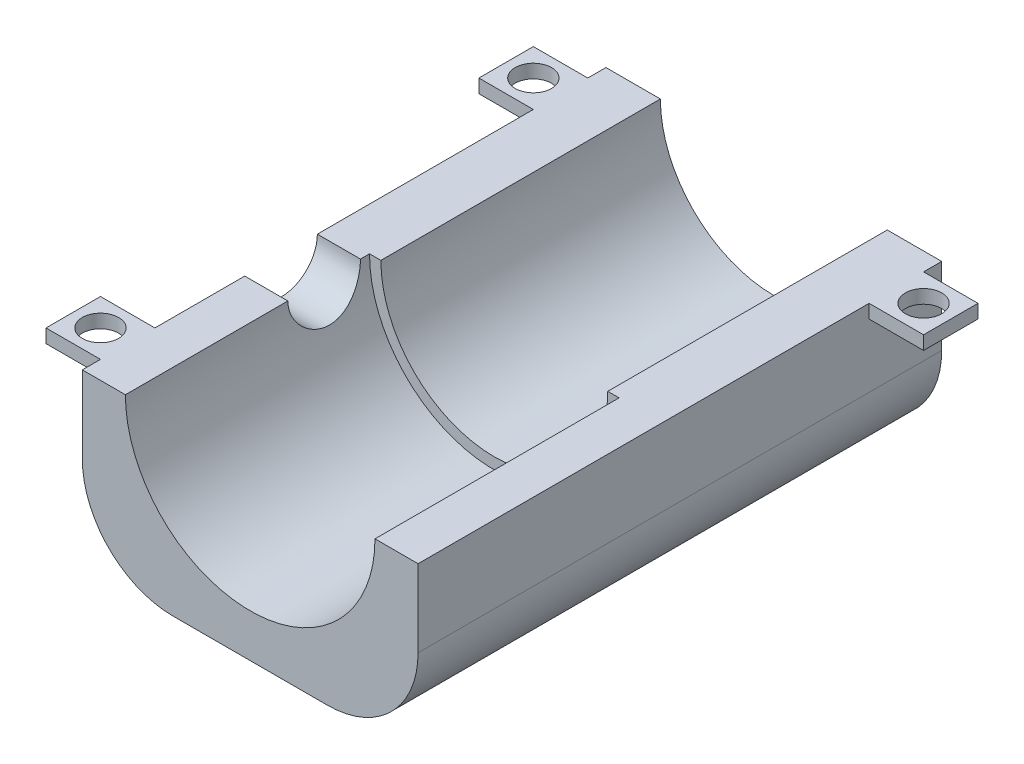
ISO-10303-21;
HEADER;
FILE_DESCRIPTION(('STEP AP214'),'2;1');
FILE_NAME('part.step','',(''),(''),'','','');
FILE_SCHEMA(('AUTOMOTIVE_DESIGN { 1 0 10303 214 1 1 1 1 }'));
ENDSEC;
DATA;
#1=APPLICATION_CONTEXT('core data for automotive mechanical design processes');
#2=APPLICATION_PROTOCOL_DEFINITION('international standard','automotive_design',2000,#1);
#3=PRODUCT_CONTEXT('',#1,'mechanical');
#4=PRODUCT('Part','Part','',(#3));
#5=PRODUCT_RELATED_PRODUCT_CATEGORY('part','',(#4));
#6=PRODUCT_DEFINITION_FORMATION('','',#4);
#7=PRODUCT_DEFINITION_CONTEXT('part definition',#1,'design');
#8=PRODUCT_DEFINITION('design','',#6,#7);
#9=PRODUCT_DEFINITION_SHAPE('','',#8);
#10=(LENGTH_UNIT() NAMED_UNIT(*) SI_UNIT(.MILLI.,.METRE.));
#11=(NAMED_UNIT(*) PLANE_ANGLE_UNIT() SI_UNIT($,.RADIAN.));
#12=(NAMED_UNIT(*) SI_UNIT($,.STERADIAN.) SOLID_ANGLE_UNIT());
#13=UNCERTAINTY_MEASURE_WITH_UNIT(LENGTH_MEASURE(1.E-05),#10,'distance_accuracy_value','');
#14=(GEOMETRIC_REPRESENTATION_CONTEXT(3) GLOBAL_UNCERTAINTY_ASSIGNED_CONTEXT((#13)) GLOBAL_UNIT_ASSIGNED_CONTEXT((#10,
#11,#12)) REPRESENTATION_CONTEXT('',''));
#15=CARTESIAN_POINT('',(0.,0.,0.));
#16=DIRECTION('',(0.,0.,1.));
#17=DIRECTION('',(1.,0.,0.));
#18=AXIS2_PLACEMENT_3D('',#15,#16,#17);
#19=CARTESIAN_POINT('',(18.5,-18.5,-57.7));
#20=DIRECTION('',(1.,0.,0.));
#21=DIRECTION('',(0.,1.,0.));
#22=AXIS2_PLACEMENT_3D('',#19,#20,#21);
#23=PLANE('',#22);
#24=DIRECTION('',(0.,0.,1.));
#25=VECTOR('',#24,1.);
#26=CARTESIAN_POINT('',(18.5,0.,-57.7));
#27=LINE('',#26,#25);
#28=CARTESIAN_POINT('',(18.5,0.,-49.7));
#29=VERTEX_POINT('',#28);
#30=CARTESIAN_POINT('',(18.5,0.,0.));
#31=VERTEX_POINT('',#30);
#32=EDGE_CURVE('E300',#29,#31,#27,.T.);
#33=ORIENTED_EDGE('',*,*,#32,.T.);
#34=DIRECTION('',(0.,1.,0.));
#35=VECTOR('',#34,1.);
#36=CARTESIAN_POINT('',(18.5,-18.5,0.));
#37=LINE('',#36,#35);
#38=CARTESIAN_POINT('',(18.5,-8.5,0.));
#39=VERTEX_POINT('',#38);
#40=EDGE_CURVE('E267',#39,#31,#37,.T.);
#41=ORIENTED_EDGE('',*,*,#40,.F.);
#42=DIRECTION('',(0.,0.,1.));
#43=VECTOR('',#42,1.);
#44=CARTESIAN_POINT('',(18.5,-8.5,-57.7));
#45=LINE('',#44,#43);
#46=CARTESIAN_POINT('',(18.5,-8.5,-57.7));
#47=VERTEX_POINT('',#46);
#48=EDGE_CURVE('E59',#39,#47,#45,.F.);
#49=ORIENTED_EDGE('',*,*,#48,.T.);
#50=DIRECTION('',(0.,1.,0.));
#51=VECTOR('',#50,1.);
#52=CARTESIAN_POINT('',(18.5,-18.5,-57.7));
#53=LINE('',#52,#51);
#54=CARTESIAN_POINT('',(18.5,0.,-57.7));
#55=VERTEX_POINT('',#54);
#56=EDGE_CURVE('E275',#47,#55,#53,.T.);
#57=ORIENTED_EDGE('',*,*,#56,.T.);
#58=CARTESIAN_POINT('',(18.5,0.,-55.7));
#59=VERTEX_POINT('',#58);
#60=EDGE_CURVE('E296',#55,#59,#27,.T.);
#61=ORIENTED_EDGE('',*,*,#60,.T.);
#62=DIRECTION('',(0.,-1.,0.));
#63=VECTOR('',#62,1.);
#64=CARTESIAN_POINT('',(18.5,0.,-55.7));
#65=LINE('',#64,#63);
#66=CARTESIAN_POINT('',(18.5,-1.49999999999999,-55.7));
#67=VERTEX_POINT('',#66);
#68=EDGE_CURVE('E424',#59,#67,#65,.T.);
#69=ORIENTED_EDGE('',*,*,#68,.T.);
#70=DIRECTION('',(0.,0.,1.));
#71=VECTOR('',#70,1.);
#72=CARTESIAN_POINT('',(18.5,-1.5,0.));
#73=LINE('',#72,#71);
#74=CARTESIAN_POINT('',(18.5,-1.5,-49.7));
#75=VERTEX_POINT('',#74);
#76=EDGE_CURVE('E439',#67,#75,#73,.T.);
#77=ORIENTED_EDGE('',*,*,#76,.T.);
#78=DIRECTION('',(0.,-1.,0.));
#79=VECTOR('',#78,1.);
#80=CARTESIAN_POINT('',(18.5,0.,-49.7));
#81=LINE('',#80,#79);
#82=EDGE_CURVE('E410',#29,#75,#81,.T.);
#83=ORIENTED_EDGE('',*,*,#82,.F.);
#84=EDGE_LOOP('',(#33,#41,#49,#57,#61,#69,#77,#83));
#85=FACE_BOUND('',#84,.T.);
#86=ADVANCED_FACE('F44',(#85),#23,.T.);
#87=CARTESIAN_POINT('',(-13.5,0.,-57.7));
#88=DIRECTION('',(0.,1.,0.));
#89=DIRECTION('',(-1.,0.,0.));
#90=AXIS2_PLACEMENT_3D('',#87,#88,#89);
#91=PLANE('',#90);
#92=DIRECTION('',(0.,0.,1.));
#93=VECTOR('',#92,1.);
#94=CARTESIAN_POINT('',(-12.5,0.,-57.7));
#95=LINE('',#94,#93);
#96=CARTESIAN_POINT('',(-12.5,0.,-57.7));
#97=VERTEX_POINT('',#96);
#98=CARTESIAN_POINT('',(-12.5,0.,-26.9));
#99=VERTEX_POINT('',#98);
#100=EDGE_CURVE('E66',#97,#99,#95,.T.);
#101=ORIENTED_EDGE('',*,*,#100,.F.);
#102=DIRECTION('',(-1.,0.,0.));
#103=VECTOR('',#102,1.);
#104=CARTESIAN_POINT('',(-13.5,0.,-57.7));
#105=LINE('',#104,#103);
#106=CARTESIAN_POINT('',(-18.5,0.,-57.7));
#107=VERTEX_POINT('',#106);
#108=EDGE_CURVE('E250',#97,#107,#105,.T.);
#109=ORIENTED_EDGE('',*,*,#108,.T.);
#110=DIRECTION('',(0.,0.,1.));
#111=VECTOR('',#110,1.);
#112=CARTESIAN_POINT('',(-18.5,0.,-57.7));
#113=LINE('',#112,#111);
#114=CARTESIAN_POINT('',(-18.5,0.,-55.7));
#115=VERTEX_POINT('',#114);
#116=EDGE_CURVE('E301',#107,#115,#113,.T.);
#117=ORIENTED_EDGE('',*,*,#116,.T.);
#118=DIRECTION('',(1.,0.,0.));
#119=VECTOR('',#118,1.);
#120=CARTESIAN_POINT('',(-24.5,0.,-55.7));
#121=LINE('',#120,#119);
#122=CARTESIAN_POINT('',(-24.5,0.,-55.7));
#123=VERTEX_POINT('',#122);
#124=EDGE_CURVE('E396',#123,#115,#121,.T.);
#125=ORIENTED_EDGE('',*,*,#124,.F.);
#126=DIRECTION('',(0.,0.,-1.));
#127=VECTOR('',#126,1.);
#128=CARTESIAN_POINT('',(-24.5,0.,-57.7));
#129=LINE('',#128,#127);
#130=CARTESIAN_POINT('',(-24.5,0.,-49.7));
#131=VERTEX_POINT('',#130);
#132=EDGE_CURVE('E385',#131,#123,#129,.T.);
#133=ORIENTED_EDGE('',*,*,#132,.F.);
#134=DIRECTION('',(1.,0.,0.));
#135=VECTOR('',#134,1.);
#136=CARTESIAN_POINT('',(-24.5,0.,-49.7));
#137=LINE('',#136,#135);
#138=CARTESIAN_POINT('',(-18.5,0.,-49.7));
#139=VERTEX_POINT('',#138);
#140=EDGE_CURVE('E414',#131,#139,#137,.T.);
#141=ORIENTED_EDGE('',*,*,#140,.T.);
#142=CARTESIAN_POINT('',(-18.5,0.,-25.9));
#143=VERTEX_POINT('',#142);
#144=EDGE_CURVE('E304',#139,#143,#113,.T.);
#145=ORIENTED_EDGE('',*,*,#144,.T.);
#146=DIRECTION('',(-1.,0.,0.));
#147=VECTOR('',#146,1.);
#148=CARTESIAN_POINT('',(-3.5,0.,-25.9));
#149=LINE('',#148,#147);
#150=CARTESIAN_POINT('',(-13.75,0.,-25.9));
#151=VERTEX_POINT('',#150);
#152=EDGE_CURVE('E463',#151,#143,#149,.T.);
#153=ORIENTED_EDGE('',*,*,#152,.F.);
#154=DIRECTION('',(0.,0.,1.));
#155=VECTOR('',#154,1.);
#156=CARTESIAN_POINT('',(-13.75,0.,-57.6459346906221));
#157=LINE('',#156,#155);
#158=CARTESIAN_POINT('',(-13.75,0.,-26.9));
#159=VERTEX_POINT('',#158);
#160=EDGE_CURVE('E74',#159,#151,#157,.T.);
#161=ORIENTED_EDGE('',*,*,#160,.F.);
#162=DIRECTION('',(-1.,0.,0.));
#163=VECTOR('',#162,1.);
#164=CARTESIAN_POINT('',(-13.5,0.,-26.9));
#165=LINE('',#164,#163);
#166=EDGE_CURVE('E252',#99,#159,#165,.T.);
#167=ORIENTED_EDGE('',*,*,#166,.F.);
#168=EDGE_LOOP('',(#101,#109,#117,#125,#133,#141,#145,#153,#161,#167));
#169=FACE_BOUND('',#168,.T.);
#170=CARTESIAN_POINT('',(-21.5,0.,-52.7));
#171=DIRECTION('',(0.,1.,0.));
#172=DIRECTION('',(0.,0.,-1.));
#173=AXIS2_PLACEMENT_3D('',#170,#171,#172);
#174=CIRCLE('',#173,2.00000000000001);
#175=CARTESIAN_POINT('',(-21.5,0.,-54.7));
#176=VERTEX_POINT('',#175);
#177=EDGE_CURVE('E525',#176,#176,#174,.T.);
#178=ORIENTED_EDGE('',*,*,#177,.F.);
#179=EDGE_LOOP('',(#178));
#180=FACE_BOUND('',#179,.T.);
#181=ADVANCED_FACE('F247',(#169,#180),#91,.T.);
#182=CARTESIAN_POINT('',(-13.75,0.,-17.9));
#183=VERTEX_POINT('',#182);
#184=CARTESIAN_POINT('',(-13.75,0.,0.));
#185=VERTEX_POINT('',#184);
#186=EDGE_CURVE('E483',#183,#185,#157,.T.);
#187=ORIENTED_EDGE('',*,*,#186,.F.);
#188=DIRECTION('',(-1.,0.,0.));
#189=VECTOR('',#188,1.);
#190=CARTESIAN_POINT('',(-3.5,0.,-17.9));
#191=LINE('',#190,#189);
#192=CARTESIAN_POINT('',(-18.5,0.,-17.9));
#193=VERTEX_POINT('',#192);
#194=EDGE_CURVE('E459',#193,#183,#191,.F.);
#195=ORIENTED_EDGE('',*,*,#194,.F.);
#196=CARTESIAN_POINT('',(-18.5,0.,-8.));
#197=VERTEX_POINT('',#196);
#198=EDGE_CURVE('E305',#193,#197,#113,.T.);
#199=ORIENTED_EDGE('',*,*,#198,.T.);
#200=DIRECTION('',(1.,0.,0.));
#201=VECTOR('',#200,1.);
#202=CARTESIAN_POINT('',(-24.5,0.,-8.));
#203=LINE('',#202,#201);
#204=CARTESIAN_POINT('',(-24.5,0.,-8.));
#205=VERTEX_POINT('',#204);
#206=EDGE_CURVE('E377',#205,#197,#203,.T.);
#207=ORIENTED_EDGE('',*,*,#206,.F.);
#208=DIRECTION('',(0.,0.,-1.));
#209=VECTOR('',#208,1.);
#210=CARTESIAN_POINT('',(-24.5,0.,-57.7));
#211=LINE('',#210,#209);
#212=CARTESIAN_POINT('',(-24.5,0.,-2.));
#213=VERTEX_POINT('',#212);
#214=EDGE_CURVE('E366',#213,#205,#211,.T.);
#215=ORIENTED_EDGE('',*,*,#214,.F.);
#216=DIRECTION('',(1.,0.,0.));
#217=VECTOR('',#216,1.);
#218=CARTESIAN_POINT('',(-24.5,0.,-2.));
#219=LINE('',#218,#217);
#220=CARTESIAN_POINT('',(-18.5,0.,-2.));
#221=VERTEX_POINT('',#220);
#222=EDGE_CURVE('E367',#213,#221,#219,.T.);
#223=ORIENTED_EDGE('',*,*,#222,.T.);
#224=CARTESIAN_POINT('',(-18.5,0.,0.));
#225=VERTEX_POINT('',#224);
#226=EDGE_CURVE('E281',#221,#225,#113,.T.);
#227=ORIENTED_EDGE('',*,*,#226,.T.);
#228=DIRECTION('',(-1.,0.,0.));
#229=VECTOR('',#228,1.);
#230=CARTESIAN_POINT('',(-13.5,0.,0.));
#231=LINE('',#230,#229);
#232=EDGE_CURVE('E282',#185,#225,#231,.T.);
#233=ORIENTED_EDGE('',*,*,#232,.F.);
#234=EDGE_LOOP('',(#187,#195,#199,#207,#215,#223,#227,#233));
#235=FACE_BOUND('',#234,.T.);
#236=CARTESIAN_POINT('',(-21.5,0.,-5.));
#237=DIRECTION('',(0.,1.,0.));
#238=DIRECTION('',(0.,0.,-1.));
#239=AXIS2_PLACEMENT_3D('',#236,#237,#238);
#240=CIRCLE('',#239,2.);
#241=CARTESIAN_POINT('',(-21.5,0.,-7.));
#242=VERTEX_POINT('',#241);
#243=EDGE_CURVE('E538',#242,#242,#240,.T.);
#244=ORIENTED_EDGE('',*,*,#243,.F.);
#245=EDGE_LOOP('',(#244));
#246=FACE_BOUND('',#245,.T.);
#247=ADVANCED_FACE('F569',(#235,#246),#91,.T.);
#248=CARTESIAN_POINT('',(18.5,0.,-57.7));
#249=DIRECTION('',(0.,1.,0.));
#250=DIRECTION('',(0.,0.,1.));
#251=AXIS2_PLACEMENT_3D('',#248,#249,#250);
#252=PLANE('',#251);
#253=DIRECTION('',(-1.,0.,0.));
#254=VECTOR('',#253,1.);
#255=CARTESIAN_POINT('',(18.5,0.,0.));
#256=LINE('',#255,#254);
#257=CARTESIAN_POINT('',(13.75,0.,0.));
#258=VERTEX_POINT('',#257);
#259=EDGE_CURVE('E260',#31,#258,#256,.T.);
#260=ORIENTED_EDGE('',*,*,#259,.F.);
#261=ORIENTED_EDGE('',*,*,#32,.F.);
#262=DIRECTION('',(-1.,0.,0.));
#263=VECTOR('',#262,1.);
#264=CARTESIAN_POINT('',(24.5,0.,-49.7));
#265=LINE('',#264,#263);
#266=CARTESIAN_POINT('',(24.5,0.,-49.7));
#267=VERTEX_POINT('',#266);
#268=EDGE_CURVE('E455',#267,#29,#265,.T.);
#269=ORIENTED_EDGE('',*,*,#268,.F.);
#270=DIRECTION('',(0.,0.,1.));
#271=VECTOR('',#270,1.);
#272=CARTESIAN_POINT('',(24.5,0.,0.));
#273=LINE('',#272,#271);
#274=CARTESIAN_POINT('',(24.5,0.,-55.7));
#275=VERTEX_POINT('',#274);
#276=EDGE_CURVE('E419',#275,#267,#273,.T.);
#277=ORIENTED_EDGE('',*,*,#276,.F.);
#278=DIRECTION('',(-1.,0.,0.));
#279=VECTOR('',#278,1.);
#280=CARTESIAN_POINT('',(24.5,0.,-55.7));
#281=LINE('',#280,#279);
#282=EDGE_CURVE('E435',#275,#59,#281,.T.);
#283=ORIENTED_EDGE('',*,*,#282,.T.);
#284=ORIENTED_EDGE('',*,*,#60,.F.);
#285=DIRECTION('',(-1.,0.,0.));
#286=VECTOR('',#285,1.);
#287=CARTESIAN_POINT('',(18.5,0.,-57.7));
#288=LINE('',#287,#286);
#289=CARTESIAN_POINT('',(12.5,0.,-57.7));
#290=VERTEX_POINT('',#289);
#291=EDGE_CURVE('E278',#55,#290,#288,.T.);
#292=ORIENTED_EDGE('',*,*,#291,.T.);
#293=DIRECTION('',(0.,0.,1.));
#294=VECTOR('',#293,1.);
#295=CARTESIAN_POINT('',(12.5,0.,-57.7));
#296=LINE('',#295,#294);
#297=CARTESIAN_POINT('',(12.5,0.,-26.9));
#298=VERTEX_POINT('',#297);
#299=EDGE_CURVE('E237',#290,#298,#296,.T.);
#300=ORIENTED_EDGE('',*,*,#299,.T.);
#301=DIRECTION('',(-1.,0.,0.));
#302=VECTOR('',#301,1.);
#303=CARTESIAN_POINT('',(13.5,0.,-26.9));
#304=LINE('',#303,#302);
#305=CARTESIAN_POINT('',(13.75,0.,-26.9));
#306=VERTEX_POINT('',#305);
#307=EDGE_CURVE('E465',#306,#298,#304,.T.);
#308=ORIENTED_EDGE('',*,*,#307,.F.);
#309=DIRECTION('',(0.,0.,1.));
#310=VECTOR('',#309,1.);
#311=CARTESIAN_POINT('',(13.75,0.,-57.6459346906221));
#312=LINE('',#311,#310);
#313=EDGE_CURVE('E476',#306,#258,#312,.T.);
#314=ORIENTED_EDGE('',*,*,#313,.T.);
#315=EDGE_LOOP('',(#260,#261,#269,#277,#283,#284,#292,#300,#308,#314));
#316=FACE_BOUND('',#315,.T.);
#317=CARTESIAN_POINT('',(21.5,0.,-52.7));
#318=DIRECTION('',(0.,1.,0.));
#319=DIRECTION('',(0.,0.,1.));
#320=AXIS2_PLACEMENT_3D('',#317,#318,#319);
#321=CIRCLE('',#320,2.00000000000001);
#322=CARTESIAN_POINT('',(21.5,0.,-50.7));
#323=VERTEX_POINT('',#322);
#324=EDGE_CURVE('E338',#323,#323,#321,.T.);
#325=ORIENTED_EDGE('',*,*,#324,.F.);
#326=EDGE_LOOP('',(#325));
#327=FACE_BOUND('',#326,.T.);
#328=ADVANCED_FACE('F599',(#316,#327),#252,.T.);
#329=CARTESIAN_POINT('',(-18.5,-18.5,-57.7));
#330=DIRECTION('',(0.,-1.,0.));
#331=DIRECTION('',(0.,0.,-1.));
#332=AXIS2_PLACEMENT_3D('',#329,#330,#331);
#333=PLANE('',#332);
#334=DIRECTION('',(0.,0.,1.));
#335=VECTOR('',#334,1.);
#336=CARTESIAN_POINT('',(7.25,-18.5,-30.2));
#337=LINE('',#336,#335);
#338=CARTESIAN_POINT('',(7.25,-18.5,-55.7));
#339=VERTEX_POINT('',#338);
#340=CARTESIAN_POINT('',(7.25,-18.5,-30.2));
#341=VERTEX_POINT('',#340);
#342=EDGE_CURVE('E478',#339,#341,#337,.T.);
#343=ORIENTED_EDGE('',*,*,#342,.F.);
#344=DIRECTION('',(1.,0.,0.));
#345=VECTOR('',#344,1.);
#346=CARTESIAN_POINT('',(7.25,-18.5,-55.7));
#347=LINE('',#346,#345);
#348=CARTESIAN_POINT('',(-7.25,-18.5,-55.7));
#349=VERTEX_POINT('',#348);
#350=EDGE_CURVE('E496',#349,#339,#347,.T.);
#351=ORIENTED_EDGE('',*,*,#350,.F.);
#352=DIRECTION('',(0.,0.,-1.));
#353=VECTOR('',#352,1.);
#354=CARTESIAN_POINT('',(-7.25,-18.5,-30.2));
#355=LINE('',#354,#353);
#356=CARTESIAN_POINT('',(-7.25,-18.5,-30.2));
#357=VERTEX_POINT('',#356);
#358=EDGE_CURVE('E515',#357,#349,#355,.T.);
#359=ORIENTED_EDGE('',*,*,#358,.F.);
#360=DIRECTION('',(-1.,0.,0.));
#361=VECTOR('',#360,1.);
#362=CARTESIAN_POINT('',(7.25,-18.5,-30.2));
#363=LINE('',#362,#361);
#364=EDGE_CURVE('E511',#341,#357,#363,.T.);
#365=ORIENTED_EDGE('',*,*,#364,.F.);
#366=EDGE_LOOP('',(#343,#351,#359,#365));
#367=FACE_BOUND('',#366,.T.);
#368=DIRECTION('',(1.,0.,0.));
#369=VECTOR('',#368,1.);
#370=CARTESIAN_POINT('',(-18.5,-18.5,0.));
#371=LINE('',#370,#369);
#372=CARTESIAN_POINT('',(-8.5,-18.5,0.));
#373=VERTEX_POINT('',#372);
#374=CARTESIAN_POINT('',(8.5,-18.5,0.));
#375=VERTEX_POINT('',#374);
#376=EDGE_CURVE('E289',#373,#375,#371,.T.);
#377=ORIENTED_EDGE('',*,*,#376,.F.);
#378=DIRECTION('',(0.,0.,1.));
#379=VECTOR('',#378,1.);
#380=CARTESIAN_POINT('',(-8.5,-18.5,-57.7));
#381=LINE('',#380,#379);
#382=CARTESIAN_POINT('',(-8.5,-18.5,-57.7));
#383=VERTEX_POINT('',#382);
#384=EDGE_CURVE('E322',#373,#383,#381,.F.);
#385=ORIENTED_EDGE('',*,*,#384,.T.);
#386=DIRECTION('',(1.,0.,0.));
#387=VECTOR('',#386,1.);
#388=CARTESIAN_POINT('',(-18.5,-18.5,-57.7));
#389=LINE('',#388,#387);
#390=CARTESIAN_POINT('',(8.5,-18.5,-57.7));
#391=VERTEX_POINT('',#390);
#392=EDGE_CURVE('E264',#383,#391,#389,.T.);
#393=ORIENTED_EDGE('',*,*,#392,.T.);
#394=DIRECTION('',(0.,0.,1.));
#395=VECTOR('',#394,1.);
#396=CARTESIAN_POINT('',(8.5,-18.5,-57.7));
#397=LINE('',#396,#395);
#398=EDGE_CURVE('E318',#391,#375,#397,.T.);
#399=ORIENTED_EDGE('',*,*,#398,.T.);
#400=EDGE_LOOP('',(#377,#385,#393,#399));
#401=FACE_BOUND('',#400,.T.);
#402=ADVANCED_FACE('F611',(#367,#401),#333,.T.);
#403=CARTESIAN_POINT('',(-18.5,0.,-57.7));
#404=DIRECTION('',(-1.,0.,0.));
#405=DIRECTION('',(0.,-1.,0.));
#406=AXIS2_PLACEMENT_3D('',#403,#404,#405);
#407=PLANE('',#406);
#408=DIRECTION('',(0.,1.,0.));
#409=VECTOR('',#408,1.);
#410=CARTESIAN_POINT('',(-18.5,0.,-8.));
#411=LINE('',#410,#409);
#412=CARTESIAN_POINT('',(-18.5,-1.5,-8.));
#413=VERTEX_POINT('',#412);
#414=EDGE_CURVE('E344',#413,#197,#411,.T.);
#415=ORIENTED_EDGE('',*,*,#414,.T.);
#416=ORIENTED_EDGE('',*,*,#198,.F.);
#417=CARTESIAN_POINT('',(-18.5,0.,-21.9));
#418=DIRECTION('',(-1.,0.,0.));
#419=DIRECTION('',(0.,-1.,0.));
#420=AXIS2_PLACEMENT_3D('',#417,#418,#419);
#421=CIRCLE('',#420,4.);
#422=EDGE_CURVE('E299',#143,#193,#421,.T.);
#423=ORIENTED_EDGE('',*,*,#422,.F.);
#424=ORIENTED_EDGE('',*,*,#144,.F.);
#425=DIRECTION('',(0.,1.,0.));
#426=VECTOR('',#425,1.);
#427=CARTESIAN_POINT('',(-18.5,0.,-49.7));
#428=LINE('',#427,#426);
#429=CARTESIAN_POINT('',(-18.5,-1.49999999999999,-49.7));
#430=VERTEX_POINT('',#429);
#431=EDGE_CURVE('E400',#430,#139,#428,.T.);
#432=ORIENTED_EDGE('',*,*,#431,.F.);
#433=DIRECTION('',(0.,0.,-1.));
#434=VECTOR('',#433,1.);
#435=CARTESIAN_POINT('',(-18.5,-1.49999999999999,-57.7));
#436=LINE('',#435,#434);
#437=CARTESIAN_POINT('',(-18.5,-1.49999999999999,-55.7));
#438=VERTEX_POINT('',#437);
#439=EDGE_CURVE('E386',#430,#438,#436,.T.);
#440=ORIENTED_EDGE('',*,*,#439,.T.);
#441=DIRECTION('',(0.,1.,0.));
#442=VECTOR('',#441,1.);
#443=CARTESIAN_POINT('',(-18.5,0.,-55.7));
#444=LINE('',#443,#442);
#445=EDGE_CURVE('E380',#438,#115,#444,.T.);
#446=ORIENTED_EDGE('',*,*,#445,.T.);
#447=ORIENTED_EDGE('',*,*,#116,.F.);
#448=DIRECTION('',(0.,-1.,0.));
#449=VECTOR('',#448,1.);
#450=CARTESIAN_POINT('',(-18.5,0.,-57.7));
#451=LINE('',#450,#449);
#452=CARTESIAN_POINT('',(-18.5,-8.5,-57.7));
#453=VERTEX_POINT('',#452);
#454=EDGE_CURVE('E258',#107,#453,#451,.T.);
#455=ORIENTED_EDGE('',*,*,#454,.T.);
#456=DIRECTION('',(0.,0.,1.));
#457=VECTOR('',#456,1.);
#458=CARTESIAN_POINT('',(-18.5,-8.5,-57.7));
#459=LINE('',#458,#457);
#460=CARTESIAN_POINT('',(-18.5,-8.5,0.));
#461=VERTEX_POINT('',#460);
#462=EDGE_CURVE('E308',#453,#461,#459,.T.);
#463=ORIENTED_EDGE('',*,*,#462,.T.);
#464=DIRECTION('',(0.,-1.,0.));
#465=VECTOR('',#464,1.);
#466=CARTESIAN_POINT('',(-18.5,0.,0.));
#467=LINE('',#466,#465);
#468=EDGE_CURVE('E285',#225,#461,#467,.T.);
#469=ORIENTED_EDGE('',*,*,#468,.F.);
#470=ORIENTED_EDGE('',*,*,#226,.F.);
#471=DIRECTION('',(0.,1.,0.));
#472=VECTOR('',#471,1.);
#473=CARTESIAN_POINT('',(-18.5,0.,-2.));
#474=LINE('',#473,#472);
#475=CARTESIAN_POINT('',(-18.5,-1.5,-2.));
#476=VERTEX_POINT('',#475);
#477=EDGE_CURVE('E358',#476,#221,#474,.T.);
#478=ORIENTED_EDGE('',*,*,#477,.F.);
#479=DIRECTION('',(0.,0.,1.));
#480=VECTOR('',#479,1.);
#481=CARTESIAN_POINT('',(-18.5,-1.5,-57.7));
#482=LINE('',#481,#480);
#483=EDGE_CURVE('E349',#413,#476,#482,.T.);
#484=ORIENTED_EDGE('',*,*,#483,.F.);
#485=EDGE_LOOP('',(#415,#416,#423,#424,#432,#440,#446,#447,#455,#463,#469,#470,#478,#484));
#486=FACE_BOUND('',#485,.T.);
#487=ADVANCED_FACE('F576',(#486),#407,.T.);
#488=CARTESIAN_POINT('',(0.,0.,-57.7));
#489=DIRECTION('',(0.,0.,1.));
#490=DIRECTION('',(1.,0.,0.));
#491=AXIS2_PLACEMENT_3D('',#488,#489,#490);
#492=PLANE('',#491);
#493=ORIENTED_EDGE('',*,*,#108,.F.);
#494=CARTESIAN_POINT('',(0.,0.,-57.7));
#495=DIRECTION('',(0.,0.,1.));
#496=DIRECTION('',(1.,0.,0.));
#497=AXIS2_PLACEMENT_3D('',#494,#495,#496);
#498=CIRCLE('',#497,12.5);
#499=EDGE_CURVE('E234',#97,#290,#498,.T.);
#500=ORIENTED_EDGE('',*,*,#499,.T.);
#501=ORIENTED_EDGE('',*,*,#291,.F.);
#502=ORIENTED_EDGE('',*,*,#56,.F.);
#503=CARTESIAN_POINT('',(8.5,-8.5,-57.7));
#504=DIRECTION('',(0.,0.,1.));
#505=DIRECTION('',(1.,0.,0.));
#506=AXIS2_PLACEMENT_3D('',#503,#504,#505);
#507=CIRCLE('',#506,10.);
#508=EDGE_CURVE('E325',#47,#391,#507,.F.);
#509=ORIENTED_EDGE('',*,*,#508,.T.);
#510=ORIENTED_EDGE('',*,*,#392,.F.);
#511=CARTESIAN_POINT('',(-8.5,-8.5,-57.7));
#512=DIRECTION('',(0.,0.,1.));
#513=DIRECTION('',(1.,0.,0.));
#514=AXIS2_PLACEMENT_3D('',#511,#512,#513);
#515=CIRCLE('',#514,10.);
#516=EDGE_CURVE('E328',#383,#453,#515,.F.);
#517=ORIENTED_EDGE('',*,*,#516,.T.);
#518=ORIENTED_EDGE('',*,*,#454,.F.);
#519=EDGE_LOOP('',(#493,#500,#501,#502,#509,#510,#517,#518));
#520=FACE_BOUND('',#519,.T.);
#521=ADVANCED_FACE('F256',(#520),#492,.F.);
#522=CARTESIAN_POINT('',(0.,0.,0.));
#523=DIRECTION('',(0.,0.,1.));
#524=DIRECTION('',(1.,0.,0.));
#525=AXIS2_PLACEMENT_3D('',#522,#523,#524);
#526=PLANE('',#525);
#527=CARTESIAN_POINT('',(0.,0.,0.));
#528=DIRECTION('',(0.,0.,1.));
#529=DIRECTION('',(1.,0.,0.));
#530=AXIS2_PLACEMENT_3D('',#527,#528,#529);
#531=CIRCLE('',#530,13.75);
#532=EDGE_CURVE('E488',#185,#258,#531,.T.);
#533=ORIENTED_EDGE('',*,*,#532,.F.);
#534=ORIENTED_EDGE('',*,*,#232,.T.);
#535=ORIENTED_EDGE('',*,*,#468,.T.);
#536=CARTESIAN_POINT('',(-8.5,-8.5,0.));
#537=DIRECTION('',(0.,0.,1.));
#538=DIRECTION('',(1.,0.,0.));
#539=AXIS2_PLACEMENT_3D('',#536,#537,#538);
#540=CIRCLE('',#539,10.);
#541=EDGE_CURVE('E315',#461,#373,#540,.T.);
#542=ORIENTED_EDGE('',*,*,#541,.T.);
#543=ORIENTED_EDGE('',*,*,#376,.T.);
#544=CARTESIAN_POINT('',(8.5,-8.5,0.));
#545=DIRECTION('',(0.,0.,1.));
#546=DIRECTION('',(1.,0.,0.));
#547=AXIS2_PLACEMENT_3D('',#544,#545,#546);
#548=CIRCLE('',#547,10.);
#549=EDGE_CURVE('E312',#375,#39,#548,.T.);
#550=ORIENTED_EDGE('',*,*,#549,.T.);
#551=ORIENTED_EDGE('',*,*,#40,.T.);
#552=ORIENTED_EDGE('',*,*,#259,.T.);
#553=EDGE_LOOP('',(#533,#534,#535,#542,#543,#550,#551,#552));
#554=FACE_BOUND('',#553,.T.);
#555=ADVANCED_FACE('F591',(#554),#526,.T.);
#556=CARTESIAN_POINT('',(0.,0.,-26.9));
#557=DIRECTION('',(0.,0.,1.));
#558=DIRECTION('',(1.,0.,0.));
#559=AXIS2_PLACEMENT_3D('',#556,#557,#558);
#560=PLANE('',#559);
#561=CARTESIAN_POINT('',(0.,0.,-26.9));
#562=DIRECTION('',(0.,0.,1.));
#563=DIRECTION('',(1.,0.,0.));
#564=AXIS2_PLACEMENT_3D('',#561,#562,#563);
#565=CIRCLE('',#564,12.5);
#566=EDGE_CURVE('E243',#99,#298,#565,.T.);
#567=ORIENTED_EDGE('',*,*,#566,.F.);
#568=ORIENTED_EDGE('',*,*,#166,.T.);
#569=CARTESIAN_POINT('',(0.,0.,-26.9));
#570=DIRECTION('',(0.,0.,1.));
#571=DIRECTION('',(1.,0.,0.));
#572=AXIS2_PLACEMENT_3D('',#569,#570,#571);
#573=CIRCLE('',#572,13.75);
#574=EDGE_CURVE('E472',#306,#159,#573,.F.);
#575=ORIENTED_EDGE('',*,*,#574,.F.);
#576=ORIENTED_EDGE('',*,*,#307,.T.);
#577=EDGE_LOOP('',(#567,#568,#575,#576));
#578=FACE_BOUND('',#577,.T.);
#579=ADVANCED_FACE('F471',(#578),#560,.T.);
#580=CARTESIAN_POINT('',(-3.5,0.,-21.9));
#581=DIRECTION('',(-1.,0.,0.));
#582=DIRECTION('',(0.,-1.,0.));
#583=AXIS2_PLACEMENT_3D('',#580,#581,#582);
#584=CYLINDRICAL_SURFACE('',#583,4.);
#585=ORIENTED_EDGE('',*,*,#194,.T.);
#586=CARTESIAN_POINT('',(-13.75,0.,-17.9));
#587=CARTESIAN_POINT('',(-13.7500124778286,-0.110044992797578,-17.8999867032553));
#588=CARTESIAN_POINT('',(-13.7486792076542,-0.22008200178239,-17.9045409869576));
#589=CARTESIAN_POINT('',(-13.743413856462,-0.439326057622756,-17.9226815157075));
#590=CARTESIAN_POINT('',(-13.7394822697006,-0.548533258330446,-17.936266043009));
#591=CARTESIAN_POINT('',(-13.7291247344609,-0.765098818917785,-17.9723227511997));
#592=CARTESIAN_POINT('',(-13.7227044976106,-0.872460828626715,-17.99477458321));
#593=CARTESIAN_POINT('',(-13.7075546638483,-1.08480316387924,-18.0483499076533));
#594=CARTESIAN_POINT('',(-13.6988250255862,-1.18978344674125,-18.0794735553565));
#595=CARTESIAN_POINT('',(-13.6695063003347,-1.50001682439799,-18.1854890308794));
#596=CARTESIAN_POINT('',(-13.645775128709,-1.70080319039537,-18.273065883978));
#597=CARTESIAN_POINT('',(-13.592421809403,-2.08477835961858,-18.4792839828081));
#598=CARTESIAN_POINT('',(-13.5627975345709,-2.26796077307713,-18.5979364503832));
#599=CARTESIAN_POINT('',(-13.4999332764975,-2.61656776445741,-18.8663388665362));
#600=CARTESIAN_POINT('',(-13.4666229346358,-2.78145278523655,-19.0167743014219));
#601=CARTESIAN_POINT('',(-13.4005671488035,-3.08404779520262,-19.3430140343641));
#602=CARTESIAN_POINT('',(-13.3678218287416,-3.22175189106192,-19.5188238197757));
#603=CARTESIAN_POINT('',(-13.3058641849341,-3.46887463978733,-19.8953424517102));
#604=CARTESIAN_POINT('',(-13.2767401838384,-3.57764072960155,-20.0964955355827));
#605=CARTESIAN_POINT('',(-13.2263769546323,-3.75957821955081,-20.5152105463896));
#606=CARTESIAN_POINT('',(-13.2051355864986,-3.83275928219378,-20.7327680004433));
#607=CARTESIAN_POINT('',(-13.1736759405694,-3.93951857008547,-21.1720449457846));
#608=CARTESIAN_POINT('',(-13.1631806759983,-3.97409412702419,-21.3935016936276));
#609=CARTESIAN_POINT('',(-13.1535764568441,-4.0057739170624,-21.8393069732242));
#610=CARTESIAN_POINT('',(-13.1544651749543,-4.00288580911795,-22.0636549045443));
#611=CARTESIAN_POINT('',(-13.1672827441117,-3.96050479286225,-22.5008483449304));
#612=CARTESIAN_POINT('',(-13.1788382241101,-3.92224977159694,-22.7138265949309));
#613=CARTESIAN_POINT('',(-13.2110849122411,-3.81221575281146,-23.1301995922076));
#614=CARTESIAN_POINT('',(-13.231776877185,-3.74043397810898,-23.3335935440335));
#615=CARTESIAN_POINT('',(-13.2802715517142,-3.56444715667514,-23.7281115040267));
#616=CARTESIAN_POINT('',(-13.3081635305395,-3.45983122055024,-23.919040756507));
#617=CARTESIAN_POINT('',(-13.3678714103791,-3.22142314027546,-24.281054716372));
#618=CARTESIAN_POINT('',(-13.3996881525533,-3.08762473696863,-24.4521351544362));
#619=CARTESIAN_POINT('',(-13.4651801924076,-2.78850339466092,-24.7766023812239));
#620=CARTESIAN_POINT('',(-13.4988795515993,-2.62215353110158,-24.9290374684187));
#621=CARTESIAN_POINT('',(-13.5632546613243,-2.26567745807521,-25.2041377370749));
#622=CARTESIAN_POINT('',(-13.5939296445148,-2.07554524218154,-25.326795374903));
#623=CARTESIAN_POINT('',(-13.6352127752614,-1.77589847704931,-25.4859660686931));
#624=CARTESIAN_POINT('',(-13.6482256436048,-1.67319285584971,-25.5350246044527));
#625=CARTESIAN_POINT('',(-13.6722673376537,-1.46379029431439,-25.62427812972));
#626=CARTESIAN_POINT('',(-13.6832969673113,-1.35709499257302,-25.6644767123162));
#627=CARTESIAN_POINT('',(-13.7030427665421,-1.14058312557789,-25.7356288144873));
#628=CARTESIAN_POINT('',(-13.7117612453853,-1.03076979823782,-25.7665915662829));
#629=CARTESIAN_POINT('',(-13.7266437219131,-0.808777117370121,-25.8190405307666));
#630=CARTESIAN_POINT('',(-13.7328088825492,-0.696598865508161,-25.8405310580254));
#631=CARTESIAN_POINT('',(-13.741710850894,-0.487054815460224,-25.8714369167153));
#632=CARTESIAN_POINT('',(-13.7448145812122,-0.389893666194362,-25.8821492970716));
#633=CARTESIAN_POINT('',(-13.7489613525327,-0.195157407133201,-25.8964292238067));
#634=CARTESIAN_POINT('',(-13.7500076101849,-0.0975831829010832,-25.9000079230925));
#635=CARTESIAN_POINT('',(-13.75,0.,-25.9));
#636=B_SPLINE_CURVE_WITH_KNOTS('',3,(#586,#587,#588,#589,#590,#591,#592,#593,#594,#595,#596,
#597,#598,#599,#600,#601,#602,#603,#604,#605,#606,#607,#608,#609,#610,#611,#612,#613,#614,#615,
#616,#617,#618,#619,#620,#621,#622,#623,#624,#625,#626,#627,#628,#629,#630,#631,#632,#633,#634,
#635),.UNSPECIFIED.,.F.,.F.,(4,2,2,2,2,2,2,2,2,2,2,2,2,2,2,2,2,2,2,2,2,2,2,2,4),(0.,
0.330019003499655,0.659975248253998,0.989178661465062,1.31838796949149,1.97608251441305,
2.63401489038714,3.30793192232619,3.98199491183546,4.6701705016906,5.35815912469621,
6.02793053273915,6.69756501694037,7.34461416222301,7.99171691520799,8.64726415385066,
9.30295213505324,9.98424227284241,10.6657048247425,11.0090375314554,11.3522307448891,
11.6950797406788,12.0377724079497,12.3308927364483,12.6235544355511),.UNSPECIFIED.);
#637=EDGE_CURVE('E12',#183,#151,#636,.T.);
#638=ORIENTED_EDGE('',*,*,#637,.T.);
#639=ORIENTED_EDGE('',*,*,#152,.T.);
#640=ORIENTED_EDGE('',*,*,#422,.T.);
#641=EDGE_LOOP('',(#585,#638,#639,#640));
#642=FACE_BOUND('',#641,.T.);
#643=ADVANCED_FACE('F588',(#642),#584,.F.);
#644=CARTESIAN_POINT('',(-8.5,-8.5,-57.7));
#645=DIRECTION('',(0.,0.,1.));
#646=DIRECTION('',(1.,0.,0.));
#647=AXIS2_PLACEMENT_3D('',#644,#645,#646);
#648=CYLINDRICAL_SURFACE('',#647,10.);
#649=ORIENTED_EDGE('',*,*,#516,.F.);
#650=ORIENTED_EDGE('',*,*,#384,.F.);
#651=ORIENTED_EDGE('',*,*,#541,.F.);
#652=ORIENTED_EDGE('',*,*,#462,.F.);
#653=EDGE_LOOP('',(#649,#650,#651,#652));
#654=FACE_BOUND('',#653,.T.);
#655=ADVANCED_FACE('F617',(#654),#648,.T.);
#656=CARTESIAN_POINT('',(8.5,-8.5,-57.7));
#657=DIRECTION('',(0.,0.,1.));
#658=DIRECTION('',(1.,0.,0.));
#659=AXIS2_PLACEMENT_3D('',#656,#657,#658);
#660=CYLINDRICAL_SURFACE('',#659,10.);
#661=ORIENTED_EDGE('',*,*,#508,.F.);
#662=ORIENTED_EDGE('',*,*,#48,.F.);
#663=ORIENTED_EDGE('',*,*,#549,.F.);
#664=ORIENTED_EDGE('',*,*,#398,.F.);
#665=EDGE_LOOP('',(#661,#662,#663,#664));
#666=FACE_BOUND('',#665,.T.);
#667=ADVANCED_FACE('F46',(#666),#660,.T.);
#668=CARTESIAN_POINT('',(24.5,0.,-49.7));
#669=DIRECTION('',(0.,0.,-1.));
#670=DIRECTION('',(-1.,0.,0.));
#671=AXIS2_PLACEMENT_3D('',#668,#669,#670);
#672=PLANE('',#671);
#673=ORIENTED_EDGE('',*,*,#82,.T.);
#674=DIRECTION('',(-1.,0.,0.));
#675=VECTOR('',#674,1.);
#676=CARTESIAN_POINT('',(24.5,-1.5,-49.7));
#677=LINE('',#676,#675);
#678=CARTESIAN_POINT('',(24.5,-1.5,-49.7));
#679=VERTEX_POINT('',#678);
#680=EDGE_CURVE('E451',#679,#75,#677,.T.);
#681=ORIENTED_EDGE('',*,*,#680,.F.);
#682=DIRECTION('',(0.,-1.,0.));
#683=VECTOR('',#682,1.);
#684=CARTESIAN_POINT('',(24.5,0.,-49.7));
#685=LINE('',#684,#683);
#686=EDGE_CURVE('E423',#267,#679,#685,.T.);
#687=ORIENTED_EDGE('',*,*,#686,.F.);
#688=ORIENTED_EDGE('',*,*,#268,.T.);
#689=EDGE_LOOP('',(#673,#681,#687,#688));
#690=FACE_BOUND('',#689,.T.);
#691=ADVANCED_FACE('F661',(#690),#672,.F.);
#692=CARTESIAN_POINT('',(24.5,-1.5,0.));
#693=DIRECTION('',(0.,-1.,0.));
#694=DIRECTION('',(1.,0.,0.));
#695=AXIS2_PLACEMENT_3D('',#692,#693,#694);
#696=PLANE('',#695);
#697=CARTESIAN_POINT('',(21.5,-1.5,-52.7));
#698=DIRECTION('',(0.,-1.,0.));
#699=DIRECTION('',(1.,0.,0.));
#700=AXIS2_PLACEMENT_3D('',#697,#698,#699);
#701=CIRCLE('',#700,2.00000000000001);
#702=CARTESIAN_POINT('',(23.5,-1.5,-52.7));
#703=VERTEX_POINT('',#702);
#704=EDGE_CURVE('E341',#703,#703,#701,.T.);
#705=ORIENTED_EDGE('',*,*,#704,.F.);
#706=EDGE_LOOP('',(#705));
#707=FACE_BOUND('',#706,.T.);
#708=ORIENTED_EDGE('',*,*,#76,.F.);
#709=DIRECTION('',(-1.,0.,0.));
#710=VECTOR('',#709,1.);
#711=CARTESIAN_POINT('',(24.5,-1.5,-55.7));
#712=LINE('',#711,#710);
#713=CARTESIAN_POINT('',(24.5,-1.5,-55.7));
#714=VERTEX_POINT('',#713);
#715=EDGE_CURVE('E447',#714,#67,#712,.T.);
#716=ORIENTED_EDGE('',*,*,#715,.F.);
#717=DIRECTION('',(0.,0.,1.));
#718=VECTOR('',#717,1.);
#719=CARTESIAN_POINT('',(24.5,-1.5,0.));
#720=LINE('',#719,#718);
#721=EDGE_CURVE('E427',#714,#679,#720,.T.);
#722=ORIENTED_EDGE('',*,*,#721,.T.);
#723=ORIENTED_EDGE('',*,*,#680,.T.);
#724=EDGE_LOOP('',(#708,#716,#722,#723));
#725=FACE_BOUND('',#724,.T.);
#726=ADVANCED_FACE('F783',(#707,#725),#696,.T.);
#727=CARTESIAN_POINT('',(24.5,0.,-55.7));
#728=DIRECTION('',(0.,0.,-1.));
#729=DIRECTION('',(-1.,0.,0.));
#730=AXIS2_PLACEMENT_3D('',#727,#728,#729);
#731=PLANE('',#730);
#732=ORIENTED_EDGE('',*,*,#68,.F.);
#733=ORIENTED_EDGE('',*,*,#282,.F.);
#734=DIRECTION('',(0.,-1.,0.));
#735=VECTOR('',#734,1.);
#736=CARTESIAN_POINT('',(24.5,0.,-55.7));
#737=LINE('',#736,#735);
#738=EDGE_CURVE('E431',#275,#714,#737,.T.);
#739=ORIENTED_EDGE('',*,*,#738,.T.);
#740=ORIENTED_EDGE('',*,*,#715,.T.);
#741=EDGE_LOOP('',(#732,#733,#739,#740));
#742=FACE_BOUND('',#741,.T.);
#743=ADVANCED_FACE('F788',(#742),#731,.T.);
#744=CARTESIAN_POINT('',(24.5,0.,0.));
#745=DIRECTION('',(1.,0.,0.));
#746=DIRECTION('',(0.,1.,0.));
#747=AXIS2_PLACEMENT_3D('',#744,#745,#746);
#748=PLANE('',#747);
#749=ORIENTED_EDGE('',*,*,#276,.T.);
#750=ORIENTED_EDGE('',*,*,#686,.T.);
#751=ORIENTED_EDGE('',*,*,#721,.F.);
#752=ORIENTED_EDGE('',*,*,#738,.F.);
#753=EDGE_LOOP('',(#749,#750,#751,#752));
#754=FACE_BOUND('',#753,.T.);
#755=ADVANCED_FACE('F730',(#754),#748,.T.);
#756=CARTESIAN_POINT('',(-24.5,0.,-55.7));
#757=DIRECTION('',(0.,0.,-1.));
#758=DIRECTION('',(-1.,0.,0.));
#759=AXIS2_PLACEMENT_3D('',#756,#757,#758);
#760=PLANE('',#759);
#761=ORIENTED_EDGE('',*,*,#445,.F.);
#762=DIRECTION('',(1.,0.,0.));
#763=VECTOR('',#762,1.);
#764=CARTESIAN_POINT('',(-24.5,-1.49999999999999,-55.7));
#765=LINE('',#764,#763);
#766=CARTESIAN_POINT('',(-24.5,-1.49999999999999,-55.7));
#767=VERTEX_POINT('',#766);
#768=EDGE_CURVE('E407',#767,#438,#765,.T.);
#769=ORIENTED_EDGE('',*,*,#768,.F.);
#770=DIRECTION('',(0.,1.,0.));
#771=VECTOR('',#770,1.);
#772=CARTESIAN_POINT('',(-24.5,0.,-55.7));
#773=LINE('',#772,#771);
#774=EDGE_CURVE('E381',#767,#123,#773,.T.);
#775=ORIENTED_EDGE('',*,*,#774,.T.);
#776=ORIENTED_EDGE('',*,*,#124,.T.);
#777=EDGE_LOOP('',(#761,#769,#775,#776));
#778=FACE_BOUND('',#777,.T.);
#779=ADVANCED_FACE('F622',(#778),#760,.T.);
#780=CARTESIAN_POINT('',(-24.5,-1.49999999999999,-57.7));
#781=DIRECTION('',(0.,-1.,0.));
#782=DIRECTION('',(1.,0.,0.));
#783=AXIS2_PLACEMENT_3D('',#780,#781,#782);
#784=PLANE('',#783);
#785=CARTESIAN_POINT('',(-21.5,-1.49999999999999,-52.7));
#786=DIRECTION('',(0.,-1.,0.));
#787=DIRECTION('',(1.,0.,0.));
#788=AXIS2_PLACEMENT_3D('',#785,#786,#787);
#789=CIRCLE('',#788,2.00000000000001);
#790=CARTESIAN_POINT('',(-19.5,-1.49999999999999,-52.7));
#791=VERTEX_POINT('',#790);
#792=EDGE_CURVE('E337',#791,#791,#789,.T.);
#793=ORIENTED_EDGE('',*,*,#792,.F.);
#794=EDGE_LOOP('',(#793));
#795=FACE_BOUND('',#794,.T.);
#796=ORIENTED_EDGE('',*,*,#439,.F.);
#797=DIRECTION('',(1.,0.,0.));
#798=VECTOR('',#797,1.);
#799=CARTESIAN_POINT('',(-24.5,-1.49999999999999,-49.7));
#800=LINE('',#799,#798);
#801=CARTESIAN_POINT('',(-24.5,-1.49999999999999,-49.7));
#802=VERTEX_POINT('',#801);
#803=EDGE_CURVE('E411',#802,#430,#800,.T.);
#804=ORIENTED_EDGE('',*,*,#803,.F.);
#805=DIRECTION('',(0.,0.,-1.));
#806=VECTOR('',#805,1.);
#807=CARTESIAN_POINT('',(-24.5,-1.49999999999999,-57.7));
#808=LINE('',#807,#806);
#809=EDGE_CURVE('E392',#802,#767,#808,.T.);
#810=ORIENTED_EDGE('',*,*,#809,.T.);
#811=ORIENTED_EDGE('',*,*,#768,.T.);
#812=EDGE_LOOP('',(#796,#804,#810,#811));
#813=FACE_BOUND('',#812,.T.);
#814=ADVANCED_FACE('F628',(#795,#813),#784,.T.);
#815=CARTESIAN_POINT('',(-24.5,0.,-49.7));
#816=DIRECTION('',(0.,0.,-1.));
#817=DIRECTION('',(-1.,0.,0.));
#818=AXIS2_PLACEMENT_3D('',#815,#816,#817);
#819=PLANE('',#818);
#820=ORIENTED_EDGE('',*,*,#431,.T.);
#821=ORIENTED_EDGE('',*,*,#140,.F.);
#822=DIRECTION('',(0.,1.,0.));
#823=VECTOR('',#822,1.);
#824=CARTESIAN_POINT('',(-24.5,0.,-49.7));
#825=LINE('',#824,#823);
#826=EDGE_CURVE('E389',#802,#131,#825,.T.);
#827=ORIENTED_EDGE('',*,*,#826,.F.);
#828=ORIENTED_EDGE('',*,*,#803,.T.);
#829=EDGE_LOOP('',(#820,#821,#827,#828));
#830=FACE_BOUND('',#829,.T.);
#831=ADVANCED_FACE('F631',(#830),#819,.F.);
#832=CARTESIAN_POINT('',(-24.5,0.,0.));
#833=DIRECTION('',(-1.,0.,0.));
#834=DIRECTION('',(0.,-1.,0.));
#835=AXIS2_PLACEMENT_3D('',#832,#833,#834);
#836=PLANE('',#835);
#837=ORIENTED_EDGE('',*,*,#774,.F.);
#838=ORIENTED_EDGE('',*,*,#809,.F.);
#839=ORIENTED_EDGE('',*,*,#826,.T.);
#840=ORIENTED_EDGE('',*,*,#132,.T.);
#841=EDGE_LOOP('',(#837,#838,#839,#840));
#842=FACE_BOUND('',#841,.T.);
#843=ADVANCED_FACE('F625',(#842),#836,.T.);
#844=CARTESIAN_POINT('',(-24.5,0.,-8.));
#845=DIRECTION('',(0.,0.,-1.));
#846=DIRECTION('',(-1.,0.,0.));
#847=AXIS2_PLACEMENT_3D('',#844,#845,#846);
#848=PLANE('',#847);
#849=ORIENTED_EDGE('',*,*,#414,.F.);
#850=DIRECTION('',(1.,0.,0.));
#851=VECTOR('',#850,1.);
#852=CARTESIAN_POINT('',(-24.5,-1.5,-8.));
#853=LINE('',#852,#851);
#854=CARTESIAN_POINT('',(-24.5,-1.5,-8.));
#855=VERTEX_POINT('',#854);
#856=EDGE_CURVE('E374',#855,#413,#853,.T.);
#857=ORIENTED_EDGE('',*,*,#856,.F.);
#858=DIRECTION('',(0.,1.,0.));
#859=VECTOR('',#858,1.);
#860=CARTESIAN_POINT('',(-24.5,0.,-8.));
#861=LINE('',#860,#859);
#862=EDGE_CURVE('E547',#855,#205,#861,.T.);
#863=ORIENTED_EDGE('',*,*,#862,.T.);
#864=ORIENTED_EDGE('',*,*,#206,.T.);
#865=EDGE_LOOP('',(#849,#857,#863,#864));
#866=FACE_BOUND('',#865,.T.);
#867=ADVANCED_FACE('F573',(#866),#848,.T.);
#868=CARTESIAN_POINT('',(-24.5,-1.5,-57.7));
#869=DIRECTION('',(0.,1.,0.));
#870=DIRECTION('',(-1.,0.,0.));
#871=AXIS2_PLACEMENT_3D('',#868,#869,#870);
#872=PLANE('',#871);
#873=CARTESIAN_POINT('',(-21.5,-1.5,-5.));
#874=DIRECTION('',(0.,1.,0.));
#875=DIRECTION('',(-1.,0.,0.));
#876=AXIS2_PLACEMENT_3D('',#873,#874,#875);
#877=CIRCLE('',#876,2.);
#878=CARTESIAN_POINT('',(-23.5,-1.5,-5.));
#879=VERTEX_POINT('',#878);
#880=EDGE_CURVE('E333',#879,#879,#877,.T.);
#881=ORIENTED_EDGE('',*,*,#880,.T.);
#882=EDGE_LOOP('',(#881));
#883=FACE_BOUND('',#882,.T.);
#884=ORIENTED_EDGE('',*,*,#483,.T.);
#885=DIRECTION('',(1.,0.,0.));
#886=VECTOR('',#885,1.);
#887=CARTESIAN_POINT('',(-24.5,-1.5,-2.));
#888=LINE('',#887,#886);
#889=CARTESIAN_POINT('',(-24.5,-1.5,-2.));
#890=VERTEX_POINT('',#889);
#891=EDGE_CURVE('E371',#890,#476,#888,.T.);
#892=ORIENTED_EDGE('',*,*,#891,.F.);
#893=DIRECTION('',(0.,0.,1.));
#894=VECTOR('',#893,1.);
#895=CARTESIAN_POINT('',(-24.5,-1.5,-57.7));
#896=LINE('',#895,#894);
#897=EDGE_CURVE('E550',#855,#890,#896,.T.);
#898=ORIENTED_EDGE('',*,*,#897,.F.);
#899=ORIENTED_EDGE('',*,*,#856,.T.);
#900=EDGE_LOOP('',(#884,#892,#898,#899));
#901=FACE_BOUND('',#900,.T.);
#902=ADVANCED_FACE('F575',(#883,#901),#872,.F.);
#903=CARTESIAN_POINT('',(-24.5,0.,-2.));
#904=DIRECTION('',(0.,0.,-1.));
#905=DIRECTION('',(-1.,0.,0.));
#906=AXIS2_PLACEMENT_3D('',#903,#904,#905);
#907=PLANE('',#906);
#908=ORIENTED_EDGE('',*,*,#477,.T.);
#909=ORIENTED_EDGE('',*,*,#222,.F.);
#910=DIRECTION('',(0.,1.,0.));
#911=VECTOR('',#910,1.);
#912=CARTESIAN_POINT('',(-24.5,0.,-2.));
#913=LINE('',#912,#911);
#914=EDGE_CURVE('E361',#890,#213,#913,.T.);
#915=ORIENTED_EDGE('',*,*,#914,.F.);
#916=ORIENTED_EDGE('',*,*,#891,.T.);
#917=EDGE_LOOP('',(#908,#909,#915,#916));
#918=FACE_BOUND('',#917,.T.);
#919=ADVANCED_FACE('F563',(#918),#907,.F.);
#920=CARTESIAN_POINT('',(-24.5,0.,0.));
#921=DIRECTION('',(1.,0.,0.));
#922=DIRECTION('',(0.,1.,0.));
#923=AXIS2_PLACEMENT_3D('',#920,#921,#922);
#924=PLANE('',#923);
#925=ORIENTED_EDGE('',*,*,#214,.T.);
#926=ORIENTED_EDGE('',*,*,#862,.F.);
#927=ORIENTED_EDGE('',*,*,#897,.T.);
#928=ORIENTED_EDGE('',*,*,#914,.T.);
#929=EDGE_LOOP('',(#925,#926,#927,#928));
#930=FACE_BOUND('',#929,.T.);
#931=ADVANCED_FACE('F559',(#930),#924,.F.);
#932=CARTESIAN_POINT('',(-21.5,-6.,-5.));
#933=DIRECTION('',(0.,1.,0.));
#934=DIRECTION('',(0.,0.,1.));
#935=AXIS2_PLACEMENT_3D('',#932,#933,#934);
#936=CYLINDRICAL_SURFACE('',#935,2.);
#937=ORIENTED_EDGE('',*,*,#243,.T.);
#938=EDGE_LOOP('',(#937));
#939=FACE_BOUND('',#938,.T.);
#940=ORIENTED_EDGE('',*,*,#880,.F.);
#941=EDGE_LOOP('',(#940));
#942=FACE_BOUND('',#941,.T.);
#943=ADVANCED_FACE('F776',(#939,#942),#936,.F.);
#944=CARTESIAN_POINT('',(-21.5,-6.,-52.7));
#945=DIRECTION('',(0.,1.,0.));
#946=DIRECTION('',(0.,0.,1.));
#947=AXIS2_PLACEMENT_3D('',#944,#945,#946);
#948=CYLINDRICAL_SURFACE('',#947,2.00000000000001);
#949=ORIENTED_EDGE('',*,*,#792,.T.);
#950=EDGE_LOOP('',(#949));
#951=FACE_BOUND('',#950,.T.);
#952=ORIENTED_EDGE('',*,*,#177,.T.);
#953=EDGE_LOOP('',(#952));
#954=FACE_BOUND('',#953,.T.);
#955=ADVANCED_FACE('F810',(#951,#954),#948,.F.);
#956=CARTESIAN_POINT('',(21.5,-6.,-52.7));
#957=DIRECTION('',(0.,1.,0.));
#958=DIRECTION('',(0.,0.,1.));
#959=AXIS2_PLACEMENT_3D('',#956,#957,#958);
#960=CYLINDRICAL_SURFACE('',#959,2.00000000000001);
#961=ORIENTED_EDGE('',*,*,#704,.T.);
#962=EDGE_LOOP('',(#961));
#963=FACE_BOUND('',#962,.T.);
#964=ORIENTED_EDGE('',*,*,#324,.T.);
#965=EDGE_LOOP('',(#964));
#966=FACE_BOUND('',#965,.T.);
#967=ADVANCED_FACE('F819',(#963,#966),#960,.F.);
#968=CARTESIAN_POINT('',(7.25,-16.5,-30.2));
#969=DIRECTION('',(1.,0.,0.));
#970=DIRECTION('',(0.,0.,-1.));
#971=AXIS2_PLACEMENT_3D('',#968,#969,#970);
#972=PLANE('',#971);
#973=ORIENTED_EDGE('',*,*,#342,.T.);
#974=DIRECTION('',(0.,-1.,0.));
#975=VECTOR('',#974,1.);
#976=CARTESIAN_POINT('',(7.25,-16.5,-30.2));
#977=LINE('',#976,#975);
#978=CARTESIAN_POINT('',(7.25,-16.5,-30.2));
#979=VERTEX_POINT('',#978);
#980=EDGE_CURVE('E508',#979,#341,#977,.T.);
#981=ORIENTED_EDGE('',*,*,#980,.F.);
#982=DIRECTION('',(0.,0.,1.));
#983=VECTOR('',#982,1.);
#984=CARTESIAN_POINT('',(7.25,-16.5,-30.2));
#985=LINE('',#984,#983);
#986=CARTESIAN_POINT('',(7.25,-16.5,-55.7));
#987=VERTEX_POINT('',#986);
#988=EDGE_CURVE('E491',#987,#979,#985,.T.);
#989=ORIENTED_EDGE('',*,*,#988,.F.);
#990=DIRECTION('',(0.,-1.,0.));
#991=VECTOR('',#990,1.);
#992=CARTESIAN_POINT('',(7.25,-16.5,-55.7));
#993=LINE('',#992,#991);
#994=EDGE_CURVE('E522',#987,#339,#993,.T.);
#995=ORIENTED_EDGE('',*,*,#994,.T.);
#996=EDGE_LOOP('',(#973,#981,#989,#995));
#997=FACE_BOUND('',#996,.T.);
#998=ADVANCED_FACE('F828',(#997),#972,.F.);
#999=CARTESIAN_POINT('',(7.25,-16.5,-55.7));
#1000=DIRECTION('',(0.,0.,-1.));
#1001=DIRECTION('',(-1.,0.,0.));
#1002=AXIS2_PLACEMENT_3D('',#999,#1000,#1001);
#1003=PLANE('',#1002);
#1004=ORIENTED_EDGE('',*,*,#350,.T.);
#1005=ORIENTED_EDGE('',*,*,#994,.F.);
#1006=DIRECTION('',(1.,0.,0.));
#1007=VECTOR('',#1006,1.);
#1008=CARTESIAN_POINT('',(7.25,-16.5,-55.7));
#1009=LINE('',#1008,#1007);
#1010=CARTESIAN_POINT('',(-7.25,-16.5,-55.7));
#1011=VERTEX_POINT('',#1010);
#1012=EDGE_CURVE('E504',#1011,#987,#1009,.T.);
#1013=ORIENTED_EDGE('',*,*,#1012,.F.);
#1014=DIRECTION('',(0.,-1.,0.));
#1015=VECTOR('',#1014,1.);
#1016=CARTESIAN_POINT('',(-7.25,-16.5,-55.7));
#1017=LINE('',#1016,#1015);
#1018=EDGE_CURVE('E526',#1011,#349,#1017,.T.);
#1019=ORIENTED_EDGE('',*,*,#1018,.T.);
#1020=EDGE_LOOP('',(#1004,#1005,#1013,#1019));
#1021=FACE_BOUND('',#1020,.T.);
#1022=ADVANCED_FACE('F837',(#1021),#1003,.F.);
#1023=CARTESIAN_POINT('',(-7.25,-16.5,-30.2));
#1024=DIRECTION('',(-1.,0.,0.));
#1025=DIRECTION('',(0.,0.,1.));
#1026=AXIS2_PLACEMENT_3D('',#1023,#1024,#1025);
#1027=PLANE('',#1026);
#1028=ORIENTED_EDGE('',*,*,#358,.T.);
#1029=ORIENTED_EDGE('',*,*,#1018,.F.);
#1030=DIRECTION('',(0.,0.,-1.));
#1031=VECTOR('',#1030,1.);
#1032=CARTESIAN_POINT('',(-7.25,-16.5,-30.2));
#1033=LINE('',#1032,#1031);
#1034=CARTESIAN_POINT('',(-7.25,-16.5,-30.2));
#1035=VERTEX_POINT('',#1034);
#1036=EDGE_CURVE('E500',#1035,#1011,#1033,.T.);
#1037=ORIENTED_EDGE('',*,*,#1036,.F.);
#1038=DIRECTION('',(0.,-1.,0.));
#1039=VECTOR('',#1038,1.);
#1040=CARTESIAN_POINT('',(-7.25,-16.5,-30.2));
#1041=LINE('',#1040,#1039);
#1042=EDGE_CURVE('E529',#1035,#357,#1041,.T.);
#1043=ORIENTED_EDGE('',*,*,#1042,.T.);
#1044=EDGE_LOOP('',(#1028,#1029,#1037,#1043));
#1045=FACE_BOUND('',#1044,.T.);
#1046=ADVANCED_FACE('F844',(#1045),#1027,.F.);
#1047=CARTESIAN_POINT('',(7.25,-16.5,-30.2));
#1048=DIRECTION('',(0.,0.,1.));
#1049=DIRECTION('',(1.,0.,0.));
#1050=AXIS2_PLACEMENT_3D('',#1047,#1048,#1049);
#1051=PLANE('',#1050);
#1052=ORIENTED_EDGE('',*,*,#364,.T.);
#1053=ORIENTED_EDGE('',*,*,#1042,.F.);
#1054=DIRECTION('',(-1.,0.,0.));
#1055=VECTOR('',#1054,1.);
#1056=CARTESIAN_POINT('',(7.25,-16.5,-30.2));
#1057=LINE('',#1056,#1055);
#1058=EDGE_CURVE('E495',#979,#1035,#1057,.T.);
#1059=ORIENTED_EDGE('',*,*,#1058,.F.);
#1060=ORIENTED_EDGE('',*,*,#980,.T.);
#1061=EDGE_LOOP('',(#1052,#1053,#1059,#1060));
#1062=FACE_BOUND('',#1061,.T.);
#1063=ADVANCED_FACE('F852',(#1062),#1051,.F.);
#1064=CARTESIAN_POINT('',(0.,-16.5,0.));
#1065=DIRECTION('',(0.,1.,0.));
#1066=DIRECTION('',(0.,0.,1.));
#1067=AXIS2_PLACEMENT_3D('',#1064,#1065,#1066);
#1068=PLANE('',#1067);
#1069=ORIENTED_EDGE('',*,*,#988,.T.);
#1070=ORIENTED_EDGE('',*,*,#1058,.T.);
#1071=ORIENTED_EDGE('',*,*,#1036,.T.);
#1072=ORIENTED_EDGE('',*,*,#1012,.T.);
#1073=EDGE_LOOP('',(#1069,#1070,#1071,#1072));
#1074=FACE_BOUND('',#1073,.T.);
#1075=ADVANCED_FACE('F860',(#1074),#1068,.F.);
#1076=CARTESIAN_POINT('',(0.,0.,-57.6459346906221));
#1077=DIRECTION('',(0.,0.,1.));
#1078=DIRECTION('',(1.,0.,0.));
#1079=AXIS2_PLACEMENT_3D('',#1076,#1077,#1078);
#1080=CYLINDRICAL_SURFACE('',#1079,13.75);
#1081=ORIENTED_EDGE('',*,*,#186,.T.);
#1082=ORIENTED_EDGE('',*,*,#532,.T.);
#1083=ORIENTED_EDGE('',*,*,#313,.F.);
#1084=ORIENTED_EDGE('',*,*,#574,.T.);
#1085=ORIENTED_EDGE('',*,*,#160,.T.);
#1086=ORIENTED_EDGE('',*,*,#637,.F.);
#1087=EDGE_LOOP('',(#1081,#1082,#1083,#1084,#1085,#1086));
#1088=FACE_BOUND('',#1087,.T.);
#1089=ADVANCED_FACE('F474',(#1088),#1080,.F.);
#1090=CARTESIAN_POINT('',(0.,0.,-57.7));
#1091=DIRECTION('',(0.,0.,1.));
#1092=DIRECTION('',(1.,0.,0.));
#1093=AXIS2_PLACEMENT_3D('',#1090,#1091,#1092);
#1094=CYLINDRICAL_SURFACE('',#1093,12.5);
#1095=ORIENTED_EDGE('',*,*,#566,.T.);
#1096=ORIENTED_EDGE('',*,*,#299,.F.);
#1097=ORIENTED_EDGE('',*,*,#499,.F.);
#1098=ORIENTED_EDGE('',*,*,#100,.T.);
#1099=EDGE_LOOP('',(#1095,#1096,#1097,#1098));
#1100=FACE_BOUND('',#1099,.T.);
#1101=ADVANCED_FACE('F235',(#1100),#1094,.F.);
#1102=CLOSED_SHELL('',(#86,#181,#247,#328,#402,#487,#521,#555,#579,#643,#655,#667,#691,#726,
#743,#755,#779,#814,#831,#843,#867,#902,#919,#931,#943,#955,#967,#998,#1022,#1046,#1063,#1075,
#1089,#1101));
#1103=MANIFOLD_SOLID_BREP('B2',#1102);
#1104=ADVANCED_BREP_SHAPE_REPRESENTATION('',(#18,#1103),#14);
#1105=SHAPE_DEFINITION_REPRESENTATION(#9,#1104);
ENDSEC;
END-ISO-10303-21;
